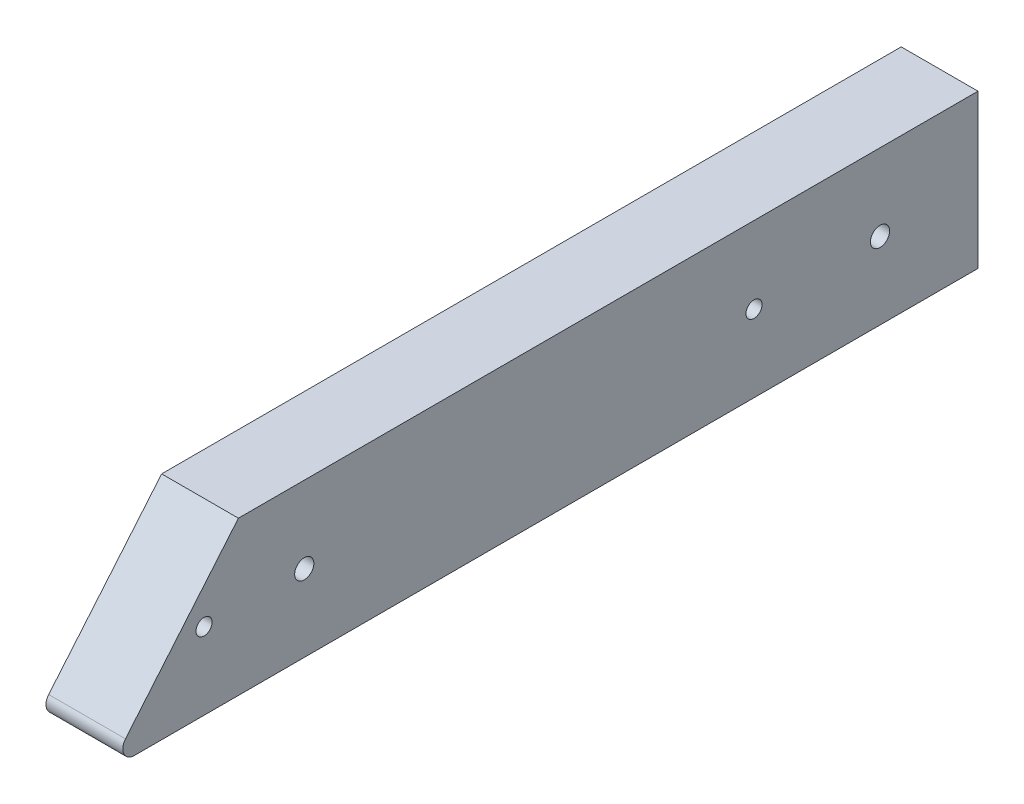
ISO-10303-21;
HEADER;
FILE_DESCRIPTION(('STEP AP214'),'2;1');
FILE_NAME('part.step','',(''),(''),'','','');
FILE_SCHEMA(('AUTOMOTIVE_DESIGN { 1 0 10303 214 1 1 1 1 }'));
ENDSEC;
DATA;
#1=APPLICATION_CONTEXT('core data for automotive mechanical design processes');
#2=APPLICATION_PROTOCOL_DEFINITION('international standard','automotive_design',2000,#1);
#3=PRODUCT_CONTEXT('',#1,'mechanical');
#4=PRODUCT('Part','Part','',(#3));
#5=PRODUCT_RELATED_PRODUCT_CATEGORY('part','',(#4));
#6=PRODUCT_DEFINITION_FORMATION('','',#4);
#7=PRODUCT_DEFINITION_CONTEXT('part definition',#1,'design');
#8=PRODUCT_DEFINITION('design','',#6,#7);
#9=PRODUCT_DEFINITION_SHAPE('','',#8);
#10=(LENGTH_UNIT() NAMED_UNIT(*) SI_UNIT(.MILLI.,.METRE.));
#11=(NAMED_UNIT(*) PLANE_ANGLE_UNIT() SI_UNIT($,.RADIAN.));
#12=(NAMED_UNIT(*) SI_UNIT($,.STERADIAN.) SOLID_ANGLE_UNIT());
#13=UNCERTAINTY_MEASURE_WITH_UNIT(LENGTH_MEASURE(1.E-05),#10,'distance_accuracy_value','');
#14=(GEOMETRIC_REPRESENTATION_CONTEXT(3) GLOBAL_UNCERTAINTY_ASSIGNED_CONTEXT((#13)) GLOBAL_UNIT_ASSIGNED_CONTEXT((#10,
#11,#12)) REPRESENTATION_CONTEXT('',''));
#15=CARTESIAN_POINT('',(0.,0.,0.));
#16=DIRECTION('',(0.,0.,1.));
#17=DIRECTION('',(1.,0.,0.));
#18=AXIS2_PLACEMENT_3D('',#15,#16,#17);
#19=CARTESIAN_POINT('',(20.,20.,-130.));
#20=DIRECTION('',(0.,-1.,0.));
#21=DIRECTION('',(0.,0.,-1.));
#22=AXIS2_PLACEMENT_3D('',#19,#20,#21);
#23=PLANE('',#22);
#24=DIRECTION('',(0.,0.,1.));
#25=VECTOR('',#24,1.);
#26=CARTESIAN_POINT('',(0.,20.,-130.));
#27=LINE('',#26,#25);
#28=CARTESIAN_POINT('',(0.,20.,-130.));
#29=VERTEX_POINT('',#28);
#30=CARTESIAN_POINT('',(0.,20.,62.6943174271063));
#31=VERTEX_POINT('',#30);
#32=EDGE_CURVE('E99',#29,#31,#27,.T.);
#33=ORIENTED_EDGE('',*,*,#32,.T.);
#34=DIRECTION('',(-1.,0.,0.));
#35=VECTOR('',#34,1.);
#36=CARTESIAN_POINT('',(20.,20.,62.6943174271063));
#37=LINE('',#36,#35);
#38=CARTESIAN_POINT('',(20.,20.,62.6943174271063));
#39=VERTEX_POINT('',#38);
#40=EDGE_CURVE('E82',#39,#31,#37,.T.);
#41=ORIENTED_EDGE('',*,*,#40,.F.);
#42=DIRECTION('',(0.,0.,1.));
#43=VECTOR('',#42,1.);
#44=CARTESIAN_POINT('',(20.,20.,-130.));
#45=LINE('',#44,#43);
#46=CARTESIAN_POINT('',(20.,20.,-130.));
#47=VERTEX_POINT('',#46);
#48=EDGE_CURVE('E87',#47,#39,#45,.T.);
#49=ORIENTED_EDGE('',*,*,#48,.F.);
#50=DIRECTION('',(-1.,0.,0.));
#51=VECTOR('',#50,1.);
#52=CARTESIAN_POINT('',(20.,20.,-130.));
#53=LINE('',#52,#51);
#54=EDGE_CURVE('E106',#47,#29,#53,.T.);
#55=ORIENTED_EDGE('',*,*,#54,.T.);
#56=EDGE_LOOP('',(#33,#41,#49,#55));
#57=FACE_BOUND('',#56,.T.);
#58=ADVANCED_FACE('F35',(#57),#23,.F.);
#59=CARTESIAN_POINT('',(20.,20.,62.6943174271063));
#60=DIRECTION('',(0.,-0.642787609686538,-0.766044443118979));
#61=DIRECTION('',(0.,0.766044443118979,-0.642787609686538));
#62=AXIS2_PLACEMENT_3D('',#59,#60,#61);
#63=PLANE('',#62);
#64=DIRECTION('',(0.,-0.766044443118979,0.642787609686538));
#65=VECTOR('',#64,1.);
#66=CARTESIAN_POINT('',(0.,20.,62.6943174271063));
#67=LINE('',#66,#65);
#68=CARTESIAN_POINT('',(0.,-15.0716371709404,92.1229152420257));
#69=VERTEX_POINT('',#68);
#70=EDGE_CURVE('E114',#31,#69,#67,.T.);
#71=ORIENTED_EDGE('',*,*,#70,.T.);
#72=DIRECTION('',(-1.,0.,0.));
#73=VECTOR('',#72,1.);
#74=CARTESIAN_POINT('',(20.,-15.0716371709404,92.1229152420257));
#75=LINE('',#74,#73);
#76=CARTESIAN_POINT('',(20.,-15.0716371709404,92.1229152420257));
#77=VERTEX_POINT('',#76);
#78=EDGE_CURVE('E43',#69,#77,#75,.F.);
#79=ORIENTED_EDGE('',*,*,#78,.T.);
#80=DIRECTION('',(0.,-0.766044443118979,0.642787609686538));
#81=VECTOR('',#80,1.);
#82=CARTESIAN_POINT('',(20.,20.,62.6943174271063));
#83=LINE('',#82,#81);
#84=EDGE_CURVE('E78',#39,#77,#83,.T.);
#85=ORIENTED_EDGE('',*,*,#84,.F.);
#86=ORIENTED_EDGE('',*,*,#40,.T.);
#87=EDGE_LOOP('',(#71,#79,#85,#86));
#88=FACE_BOUND('',#87,.T.);
#89=ADVANCED_FACE('F80',(#88),#63,.F.);
#90=CARTESIAN_POINT('',(20.,-20.,96.2583026741974));
#91=DIRECTION('',(0.,1.,0.));
#92=DIRECTION('',(0.,0.,1.));
#93=AXIS2_PLACEMENT_3D('',#90,#91,#92);
#94=PLANE('',#93);
#95=DIRECTION('',(0.,0.,-1.));
#96=VECTOR('',#95,1.);
#97=CARTESIAN_POINT('',(20.,-20.,96.2583026741974));
#98=LINE('',#97,#96);
#99=CARTESIAN_POINT('',(20.,-20.,89.8247819126688));
#100=VERTEX_POINT('',#99);
#101=CARTESIAN_POINT('',(20.,-20.,-130.));
#102=VERTEX_POINT('',#101);
#103=EDGE_CURVE('E86',#100,#102,#98,.T.);
#104=ORIENTED_EDGE('',*,*,#103,.F.);
#105=DIRECTION('',(-1.,0.,0.));
#106=VECTOR('',#105,1.);
#107=CARTESIAN_POINT('',(20.,-20.,89.8247819126688));
#108=LINE('',#107,#106);
#109=CARTESIAN_POINT('',(0.,-20.,89.8247819126688));
#110=VERTEX_POINT('',#109);
#111=EDGE_CURVE('E100',#100,#110,#108,.T.);
#112=ORIENTED_EDGE('',*,*,#111,.T.);
#113=DIRECTION('',(0.,0.,-1.));
#114=VECTOR('',#113,1.);
#115=CARTESIAN_POINT('',(0.,-20.,96.2583026741974));
#116=LINE('',#115,#114);
#117=CARTESIAN_POINT('',(0.,-20.,-130.));
#118=VERTEX_POINT('',#117);
#119=EDGE_CURVE('E112',#110,#118,#116,.T.);
#120=ORIENTED_EDGE('',*,*,#119,.T.);
#121=DIRECTION('',(-1.,0.,0.));
#122=VECTOR('',#121,1.);
#123=CARTESIAN_POINT('',(20.,-20.,-130.));
#124=LINE('',#123,#122);
#125=EDGE_CURVE('E101',#102,#118,#124,.T.);
#126=ORIENTED_EDGE('',*,*,#125,.F.);
#127=EDGE_LOOP('',(#104,#112,#120,#126));
#128=FACE_BOUND('',#127,.T.);
#129=ADVANCED_FACE('F171',(#128),#94,.F.);
#130=CARTESIAN_POINT('',(20.,-20.,-130.));
#131=DIRECTION('',(0.,0.,1.));
#132=DIRECTION('',(1.,0.,0.));
#133=AXIS2_PLACEMENT_3D('',#130,#131,#132);
#134=PLANE('',#133);
#135=DIRECTION('',(0.,1.,0.));
#136=VECTOR('',#135,1.);
#137=CARTESIAN_POINT('',(0.,-20.,-130.));
#138=LINE('',#137,#136);
#139=EDGE_CURVE('E96',#118,#29,#138,.T.);
#140=ORIENTED_EDGE('',*,*,#139,.T.);
#141=ORIENTED_EDGE('',*,*,#54,.F.);
#142=DIRECTION('',(0.,1.,0.));
#143=VECTOR('',#142,1.);
#144=CARTESIAN_POINT('',(20.,-20.,-130.));
#145=LINE('',#144,#143);
#146=EDGE_CURVE('E92',#102,#47,#145,.T.);
#147=ORIENTED_EDGE('',*,*,#146,.F.);
#148=ORIENTED_EDGE('',*,*,#125,.T.);
#149=EDGE_LOOP('',(#140,#141,#147,#148));
#150=FACE_BOUND('',#149,.T.);
#151=ADVANCED_FACE('F149',(#150),#134,.F.);
#152=CARTESIAN_POINT('',(20.,0.,0.));
#153=DIRECTION('',(-1.,0.,0.));
#154=DIRECTION('',(0.,0.,1.));
#155=AXIS2_PLACEMENT_3D('',#152,#153,#154);
#156=PLANE('',#155);
#157=CARTESIAN_POINT('',(20.,0.,71.6438663146582));
#158=DIRECTION('',(1.,0.,0.));
#159=DIRECTION('',(0.,0.,-1.));
#160=AXIS2_PLACEMENT_3D('',#157,#158,#159);
#161=CIRCLE('',#160,2.1);
#162=CARTESIAN_POINT('',(20.,0.,69.5438663146582));
#163=VERTEX_POINT('',#162);
#164=EDGE_CURVE('E140',#163,#163,#161,.T.);
#165=ORIENTED_EDGE('',*,*,#164,.F.);
#166=EDGE_LOOP('',(#165));
#167=FACE_BOUND('',#166,.T.);
#168=CARTESIAN_POINT('',(20.,0.,-71.6438663146582));
#169=DIRECTION('',(1.,0.,0.));
#170=DIRECTION('',(0.,0.,-1.));
#171=AXIS2_PLACEMENT_3D('',#168,#169,#170);
#172=CIRCLE('',#171,2.1);
#173=CARTESIAN_POINT('',(20.,0.,-73.7438663146582));
#174=VERTEX_POINT('',#173);
#175=EDGE_CURVE('E134',#174,#174,#172,.T.);
#176=ORIENTED_EDGE('',*,*,#175,.F.);
#177=EDGE_LOOP('',(#176));
#178=FACE_BOUND('',#177,.T.);
#179=CARTESIAN_POINT('',(20.,0.,45.5357205280127));
#180=DIRECTION('',(-1.,0.,0.));
#181=DIRECTION('',(0.,0.,1.));
#182=AXIS2_PLACEMENT_3D('',#179,#180,#181);
#183=CIRCLE('',#182,2.5);
#184=CARTESIAN_POINT('',(20.,0.,48.0357205280127));
#185=VERTEX_POINT('',#184);
#186=EDGE_CURVE('E125',#185,#185,#183,.T.);
#187=ORIENTED_EDGE('',*,*,#186,.T.);
#188=EDGE_LOOP('',(#187));
#189=FACE_BOUND('',#188,.T.);
#190=CARTESIAN_POINT('',(20.,0.,-104.464279471987));
#191=DIRECTION('',(-1.,0.,0.));
#192=DIRECTION('',(0.,0.,1.));
#193=AXIS2_PLACEMENT_3D('',#190,#191,#192);
#194=CIRCLE('',#193,2.5);
#195=CARTESIAN_POINT('',(20.,0.,-101.964279471987));
#196=VERTEX_POINT('',#195);
#197=EDGE_CURVE('E117',#196,#196,#194,.T.);
#198=ORIENTED_EDGE('',*,*,#197,.T.);
#199=EDGE_LOOP('',(#198));
#200=FACE_BOUND('',#199,.T.);
#201=ORIENTED_EDGE('',*,*,#84,.T.);
#202=CARTESIAN_POINT('',(20.,-17.,89.8247819126688));
#203=DIRECTION('',(-1.,0.,0.));
#204=DIRECTION('',(0.,0.,1.));
#205=AXIS2_PLACEMENT_3D('',#202,#203,#204);
#206=CIRCLE('',#205,3.);
#207=EDGE_CURVE('E11',#77,#100,#206,.F.);
#208=ORIENTED_EDGE('',*,*,#207,.T.);
#209=ORIENTED_EDGE('',*,*,#103,.T.);
#210=ORIENTED_EDGE('',*,*,#146,.T.);
#211=ORIENTED_EDGE('',*,*,#48,.T.);
#212=EDGE_LOOP('',(#201,#208,#209,#210,#211));
#213=FACE_BOUND('',#212,.T.);
#214=ADVANCED_FACE('F90',(#167,#178,#189,#200,#213),#156,.F.);
#215=CARTESIAN_POINT('',(0.,0.,0.));
#216=DIRECTION('',(-1.,0.,0.));
#217=DIRECTION('',(0.,0.,1.));
#218=AXIS2_PLACEMENT_3D('',#215,#216,#217);
#219=PLANE('',#218);
#220=CARTESIAN_POINT('',(0.,0.,71.6438663146582));
#221=DIRECTION('',(1.,0.,0.));
#222=DIRECTION('',(0.,0.,-1.));
#223=AXIS2_PLACEMENT_3D('',#220,#221,#222);
#224=CIRCLE('',#223,2.1);
#225=CARTESIAN_POINT('',(0.,0.,69.5438663146582));
#226=VERTEX_POINT('',#225);
#227=EDGE_CURVE('E137',#226,#226,#224,.T.);
#228=ORIENTED_EDGE('',*,*,#227,.T.);
#229=EDGE_LOOP('',(#228));
#230=FACE_BOUND('',#229,.T.);
#231=CARTESIAN_POINT('',(0.,0.,-71.6438663146582));
#232=DIRECTION('',(1.,0.,0.));
#233=DIRECTION('',(0.,0.,-1.));
#234=AXIS2_PLACEMENT_3D('',#231,#232,#233);
#235=CIRCLE('',#234,2.1);
#236=CARTESIAN_POINT('',(0.,0.,-73.7438663146582));
#237=VERTEX_POINT('',#236);
#238=EDGE_CURVE('E131',#237,#237,#235,.T.);
#239=ORIENTED_EDGE('',*,*,#238,.T.);
#240=EDGE_LOOP('',(#239));
#241=FACE_BOUND('',#240,.T.);
#242=CARTESIAN_POINT('',(0.,0.,45.5357205280127));
#243=DIRECTION('',(-1.,0.,0.));
#244=DIRECTION('',(0.,0.,1.));
#245=AXIS2_PLACEMENT_3D('',#242,#243,#244);
#246=CIRCLE('',#245,2.49999999999999);
#247=CARTESIAN_POINT('',(0.,0.,48.0357205280127));
#248=VERTEX_POINT('',#247);
#249=EDGE_CURVE('E128',#248,#248,#246,.T.);
#250=ORIENTED_EDGE('',*,*,#249,.F.);
#251=EDGE_LOOP('',(#250));
#252=FACE_BOUND('',#251,.T.);
#253=CARTESIAN_POINT('',(0.,0.,-104.464279471987));
#254=DIRECTION('',(-1.,0.,0.));
#255=DIRECTION('',(0.,0.,1.));
#256=AXIS2_PLACEMENT_3D('',#253,#254,#255);
#257=CIRCLE('',#256,2.49999999999999);
#258=CARTESIAN_POINT('',(0.,0.,-101.964279471987));
#259=VERTEX_POINT('',#258);
#260=EDGE_CURVE('E122',#259,#259,#257,.T.);
#261=ORIENTED_EDGE('',*,*,#260,.F.);
#262=EDGE_LOOP('',(#261));
#263=FACE_BOUND('',#262,.T.);
#264=ORIENTED_EDGE('',*,*,#119,.F.);
#265=CARTESIAN_POINT('',(0.,-17.,89.8247819126688));
#266=DIRECTION('',(-1.,0.,0.));
#267=DIRECTION('',(0.,0.,1.));
#268=AXIS2_PLACEMENT_3D('',#265,#266,#267);
#269=CIRCLE('',#268,3.);
#270=EDGE_CURVE('E57',#110,#69,#269,.T.);
#271=ORIENTED_EDGE('',*,*,#270,.T.);
#272=ORIENTED_EDGE('',*,*,#70,.F.);
#273=ORIENTED_EDGE('',*,*,#32,.F.);
#274=ORIENTED_EDGE('',*,*,#139,.F.);
#275=EDGE_LOOP('',(#264,#271,#272,#273,#274));
#276=FACE_BOUND('',#275,.T.);
#277=ADVANCED_FACE('F148',(#230,#241,#252,#263,#276),#219,.T.);
#278=CARTESIAN_POINT('',(0.,0.,-104.464279471987));
#279=DIRECTION('',(-1.,0.,0.));
#280=DIRECTION('',(0.,0.,1.));
#281=AXIS2_PLACEMENT_3D('',#278,#279,#280);
#282=CYLINDRICAL_SURFACE('',#281,2.49999999999999);
#283=ORIENTED_EDGE('',*,*,#197,.F.);
#284=EDGE_LOOP('',(#283));
#285=FACE_BOUND('',#284,.T.);
#286=ORIENTED_EDGE('',*,*,#260,.T.);
#287=EDGE_LOOP('',(#286));
#288=FACE_BOUND('',#287,.T.);
#289=ADVANCED_FACE('F157',(#285,#288),#282,.F.);
#290=CARTESIAN_POINT('',(0.,0.,45.5357205280127));
#291=DIRECTION('',(-1.,0.,0.));
#292=DIRECTION('',(0.,0.,1.));
#293=AXIS2_PLACEMENT_3D('',#290,#291,#292);
#294=CYLINDRICAL_SURFACE('',#293,2.49999999999999);
#295=ORIENTED_EDGE('',*,*,#186,.F.);
#296=EDGE_LOOP('',(#295));
#297=FACE_BOUND('',#296,.T.);
#298=ORIENTED_EDGE('',*,*,#249,.T.);
#299=EDGE_LOOP('',(#298));
#300=FACE_BOUND('',#299,.T.);
#301=ADVANCED_FACE('F160',(#297,#300),#294,.F.);
#302=CARTESIAN_POINT('',(20.,-17.,89.8247819126688));
#303=DIRECTION('',(-1.,0.,0.));
#304=DIRECTION('',(0.,0.,1.));
#305=AXIS2_PLACEMENT_3D('',#302,#303,#304);
#306=CYLINDRICAL_SURFACE('',#305,3.);
#307=ORIENTED_EDGE('',*,*,#207,.F.);
#308=ORIENTED_EDGE('',*,*,#78,.F.);
#309=ORIENTED_EDGE('',*,*,#270,.F.);
#310=ORIENTED_EDGE('',*,*,#111,.F.);
#311=EDGE_LOOP('',(#307,#308,#309,#310));
#312=FACE_BOUND('',#311,.T.);
#313=ADVANCED_FACE('F37',(#312),#306,.T.);
#314=CARTESIAN_POINT('',(20.,0.,-71.6438663146582));
#315=DIRECTION('',(1.,0.,0.));
#316=DIRECTION('',(0.,0.,-1.));
#317=AXIS2_PLACEMENT_3D('',#314,#315,#316);
#318=CYLINDRICAL_SURFACE('',#317,2.1);
#319=ORIENTED_EDGE('',*,*,#238,.F.);
#320=EDGE_LOOP('',(#319));
#321=FACE_BOUND('',#320,.T.);
#322=ORIENTED_EDGE('',*,*,#175,.T.);
#323=EDGE_LOOP('',(#322));
#324=FACE_BOUND('',#323,.T.);
#325=ADVANCED_FACE('F176',(#321,#324),#318,.F.);
#326=CARTESIAN_POINT('',(20.,0.,71.6438663146582));
#327=DIRECTION('',(1.,0.,0.));
#328=DIRECTION('',(0.,0.,-1.));
#329=AXIS2_PLACEMENT_3D('',#326,#327,#328);
#330=CYLINDRICAL_SURFACE('',#329,2.1);
#331=ORIENTED_EDGE('',*,*,#227,.F.);
#332=EDGE_LOOP('',(#331));
#333=FACE_BOUND('',#332,.T.);
#334=ORIENTED_EDGE('',*,*,#164,.T.);
#335=EDGE_LOOP('',(#334));
#336=FACE_BOUND('',#335,.T.);
#337=ADVANCED_FACE('F144',(#333,#336),#330,.F.);
#338=CLOSED_SHELL('',(#58,#89,#129,#151,#214,#277,#289,#301,#313,#325,#337));
#339=MANIFOLD_SOLID_BREP('B2',#338);
#340=ADVANCED_BREP_SHAPE_REPRESENTATION('',(#18,#339),#14);
#341=SHAPE_DEFINITION_REPRESENTATION(#9,#340);
ENDSEC;
END-ISO-10303-21;
